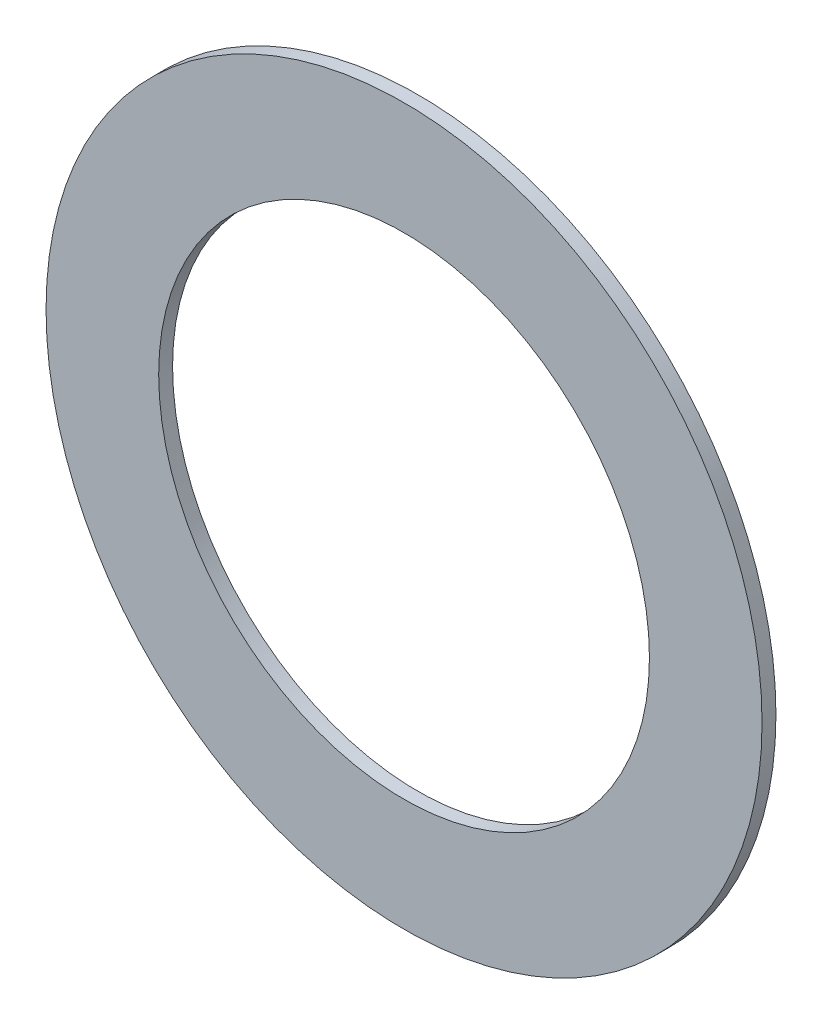
ISO-10303-21;
HEADER;
FILE_DESCRIPTION(('STEP AP214'),'2;1');
FILE_NAME('part.step','',(''),(''),'','','');
FILE_SCHEMA(('AUTOMOTIVE_DESIGN { 1 0 10303 214 1 1 1 1 }'));
ENDSEC;
DATA;
#1=APPLICATION_CONTEXT('core data for automotive mechanical design processes');
#2=APPLICATION_PROTOCOL_DEFINITION('international standard','automotive_design',2000,#1);
#3=PRODUCT_CONTEXT('',#1,'mechanical');
#4=PRODUCT('Part','Part','',(#3));
#5=PRODUCT_RELATED_PRODUCT_CATEGORY('part','',(#4));
#6=PRODUCT_DEFINITION_FORMATION('','',#4);
#7=PRODUCT_DEFINITION_CONTEXT('part definition',#1,'design');
#8=PRODUCT_DEFINITION('design','',#6,#7);
#9=PRODUCT_DEFINITION_SHAPE('','',#8);
#10=(LENGTH_UNIT() NAMED_UNIT(*) SI_UNIT(.MILLI.,.METRE.));
#11=(NAMED_UNIT(*) PLANE_ANGLE_UNIT() SI_UNIT($,.RADIAN.));
#12=(NAMED_UNIT(*) SI_UNIT($,.STERADIAN.) SOLID_ANGLE_UNIT());
#13=UNCERTAINTY_MEASURE_WITH_UNIT(LENGTH_MEASURE(1.E-05),#10,'distance_accuracy_value','');
#14=(GEOMETRIC_REPRESENTATION_CONTEXT(3) GLOBAL_UNCERTAINTY_ASSIGNED_CONTEXT((#13)) GLOBAL_UNIT_ASSIGNED_CONTEXT((#10,
#11,#12)) REPRESENTATION_CONTEXT('',''));
#15=CARTESIAN_POINT('',(0.,0.,0.));
#16=DIRECTION('',(0.,0.,1.));
#17=DIRECTION('',(1.,0.,0.));
#18=AXIS2_PLACEMENT_3D('',#15,#16,#17);
#19=CARTESIAN_POINT('',(0.,0.,1.));
#20=DIRECTION('',(0.,0.,1.));
#21=DIRECTION('',(1.,0.,0.));
#22=AXIS2_PLACEMENT_3D('',#19,#20,#21);
#23=PLANE('',#22);
#24=CARTESIAN_POINT('',(0.,0.,1.));
#25=DIRECTION('',(0.,0.,1.));
#26=DIRECTION('',(1.,0.,0.));
#27=AXIS2_PLACEMENT_3D('',#24,#25,#26);
#28=CIRCLE('',#27,25.75);
#29=CARTESIAN_POINT('',(25.75,0.,1.));
#30=VERTEX_POINT('',#29);
#31=EDGE_CURVE('E10',#30,#30,#28,.T.);
#32=ORIENTED_EDGE('',*,*,#31,.T.);
#33=EDGE_LOOP('',(#32));
#34=FACE_BOUND('',#33,.T.);
#35=CARTESIAN_POINT('',(0.,0.,1.));
#36=DIRECTION('',(0.,0.,1.));
#37=DIRECTION('',(1.,0.,0.));
#38=AXIS2_PLACEMENT_3D('',#35,#36,#37);
#39=CIRCLE('',#38,17.65);
#40=CARTESIAN_POINT('',(17.65,0.,1.));
#41=VERTEX_POINT('',#40);
#42=EDGE_CURVE('E48',#41,#41,#39,.T.);
#43=ORIENTED_EDGE('',*,*,#42,.F.);
#44=EDGE_LOOP('',(#43));
#45=FACE_BOUND('',#44,.T.);
#46=ADVANCED_FACE('F37',(#34,#45),#23,.T.);
#47=CARTESIAN_POINT('',(0.,0.,0.));
#48=DIRECTION('',(0.,0.,1.));
#49=DIRECTION('',(1.,0.,0.));
#50=AXIS2_PLACEMENT_3D('',#47,#48,#49);
#51=PLANE('',#50);
#52=CARTESIAN_POINT('',(0.,0.,0.));
#53=DIRECTION('',(0.,0.,1.));
#54=DIRECTION('',(1.,0.,0.));
#55=AXIS2_PLACEMENT_3D('',#52,#53,#54);
#56=CIRCLE('',#55,25.75);
#57=CARTESIAN_POINT('',(25.75,0.,0.));
#58=VERTEX_POINT('',#57);
#59=EDGE_CURVE('E41',#58,#58,#56,.T.);
#60=ORIENTED_EDGE('',*,*,#59,.F.);
#61=EDGE_LOOP('',(#60));
#62=FACE_BOUND('',#61,.T.);
#63=CARTESIAN_POINT('',(0.,0.,0.));
#64=DIRECTION('',(0.,0.,1.));
#65=DIRECTION('',(1.,0.,0.));
#66=AXIS2_PLACEMENT_3D('',#63,#64,#65);
#67=CIRCLE('',#66,17.65);
#68=CARTESIAN_POINT('',(17.65,0.,0.));
#69=VERTEX_POINT('',#68);
#70=EDGE_CURVE('E50',#69,#69,#67,.T.);
#71=ORIENTED_EDGE('',*,*,#70,.T.);
#72=EDGE_LOOP('',(#71));
#73=FACE_BOUND('',#72,.T.);
#74=ADVANCED_FACE('F60',(#62,#73),#51,.F.);
#75=CARTESIAN_POINT('',(0.,0.,1.));
#76=DIRECTION('',(0.,0.,-1.));
#77=DIRECTION('',(-1.,0.,0.));
#78=AXIS2_PLACEMENT_3D('',#75,#76,#77);
#79=CYLINDRICAL_SURFACE('',#78,25.75);
#80=ORIENTED_EDGE('',*,*,#31,.F.);
#81=EDGE_LOOP('',(#80));
#82=FACE_BOUND('',#81,.T.);
#83=ORIENTED_EDGE('',*,*,#59,.T.);
#84=EDGE_LOOP('',(#83));
#85=FACE_BOUND('',#84,.T.);
#86=ADVANCED_FACE('F39',(#82,#85),#79,.T.);
#87=CARTESIAN_POINT('',(0.,0.,1.));
#88=DIRECTION('',(0.,0.,-1.));
#89=DIRECTION('',(-1.,0.,0.));
#90=AXIS2_PLACEMENT_3D('',#87,#88,#89);
#91=CYLINDRICAL_SURFACE('',#90,17.65);
#92=ORIENTED_EDGE('',*,*,#42,.T.);
#93=EDGE_LOOP('',(#92));
#94=FACE_BOUND('',#93,.T.);
#95=ORIENTED_EDGE('',*,*,#70,.F.);
#96=EDGE_LOOP('',(#95));
#97=FACE_BOUND('',#96,.T.);
#98=ADVANCED_FACE('F56',(#94,#97),#91,.F.);
#99=CLOSED_SHELL('',(#46,#74,#86,#98));
#100=MANIFOLD_SOLID_BREP('B2',#99);
#101=ADVANCED_BREP_SHAPE_REPRESENTATION('',(#18,#100),#14);
#102=SHAPE_DEFINITION_REPRESENTATION(#9,#101);
ENDSEC;
END-ISO-10303-21;
